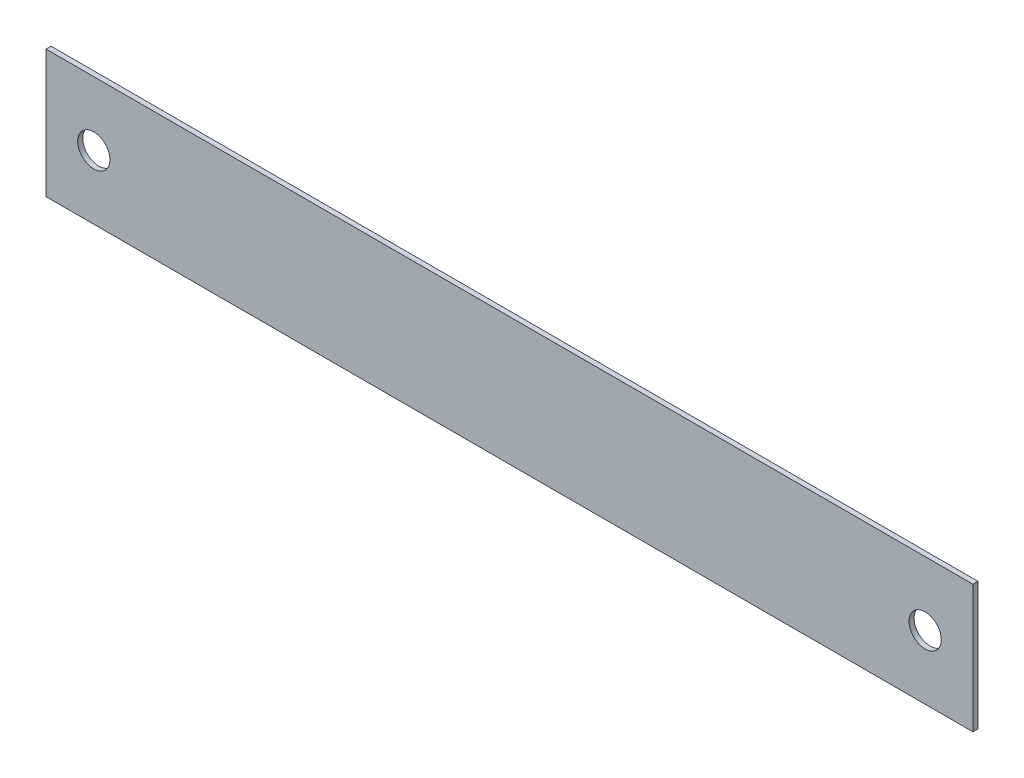
ISO-10303-21;
HEADER;
FILE_DESCRIPTION(('STEP AP214'),'2;1');
FILE_NAME('part.step','',(''),(''),'','','');
FILE_SCHEMA(('AUTOMOTIVE_DESIGN { 1 0 10303 214 1 1 1 1 }'));
ENDSEC;
DATA;
#1=APPLICATION_CONTEXT('core data for automotive mechanical design processes');
#2=APPLICATION_PROTOCOL_DEFINITION('international standard','automotive_design',2000,#1);
#3=PRODUCT_CONTEXT('',#1,'mechanical');
#4=PRODUCT('Part','Part','',(#3));
#5=PRODUCT_RELATED_PRODUCT_CATEGORY('part','',(#4));
#6=PRODUCT_DEFINITION_FORMATION('','',#4);
#7=PRODUCT_DEFINITION_CONTEXT('part definition',#1,'design');
#8=PRODUCT_DEFINITION('design','',#6,#7);
#9=PRODUCT_DEFINITION_SHAPE('','',#8);
#10=(LENGTH_UNIT() NAMED_UNIT(*) SI_UNIT(.MILLI.,.METRE.));
#11=(NAMED_UNIT(*) PLANE_ANGLE_UNIT() SI_UNIT($,.RADIAN.));
#12=(NAMED_UNIT(*) SI_UNIT($,.STERADIAN.) SOLID_ANGLE_UNIT());
#13=UNCERTAINTY_MEASURE_WITH_UNIT(LENGTH_MEASURE(1.E-05),#10,'distance_accuracy_value','');
#14=(GEOMETRIC_REPRESENTATION_CONTEXT(3) GLOBAL_UNCERTAINTY_ASSIGNED_CONTEXT((#13)) GLOBAL_UNIT_ASSIGNED_CONTEXT((#10,
#11,#12)) REPRESENTATION_CONTEXT('',''));
#15=CARTESIAN_POINT('',(0.,0.,0.));
#16=DIRECTION('',(0.,0.,1.));
#17=DIRECTION('',(1.,0.,0.));
#18=AXIS2_PLACEMENT_3D('',#15,#16,#17);
#19=CARTESIAN_POINT('',(0.,0.,0.5));
#20=DIRECTION('',(0.,0.,1.));
#21=DIRECTION('',(1.,0.,0.));
#22=AXIS2_PLACEMENT_3D('',#19,#20,#21);
#23=PLANE('',#22);
#24=CARTESIAN_POINT('',(0.,0.,0.5));
#25=DIRECTION('',(0.,0.,1.));
#26=DIRECTION('',(1.,0.,0.));
#27=AXIS2_PLACEMENT_3D('',#24,#25,#26);
#28=CIRCLE('',#27,1.6);
#29=CARTESIAN_POINT('',(1.6,0.,0.5));
#30=VERTEX_POINT('',#29);
#31=EDGE_CURVE('E106',#30,#30,#28,.T.);
#32=ORIENTED_EDGE('',*,*,#31,.F.);
#33=EDGE_LOOP('',(#32));
#34=FACE_BOUND('',#33,.T.);
#35=DIRECTION('',(0.,-1.,0.));
#36=VECTOR('',#35,1.);
#37=CARTESIAN_POINT('',(-4.75,6.35,0.5));
#38=LINE('',#37,#36);
#39=CARTESIAN_POINT('',(-4.75,6.35,0.5));
#40=VERTEX_POINT('',#39);
#41=CARTESIAN_POINT('',(-4.75,-6.35,0.5));
#42=VERTEX_POINT('',#41);
#43=EDGE_CURVE('E93',#40,#42,#38,.T.);
#44=ORIENTED_EDGE('',*,*,#43,.T.);
#45=DIRECTION('',(1.,0.,0.));
#46=VECTOR('',#45,1.);
#47=CARTESIAN_POINT('',(-4.75,-6.35,0.5));
#48=LINE('',#47,#46);
#49=CARTESIAN_POINT('',(87.35,-6.35,0.5));
#50=VERTEX_POINT('',#49);
#51=EDGE_CURVE('E88',#42,#50,#48,.T.);
#52=ORIENTED_EDGE('',*,*,#51,.T.);
#53=DIRECTION('',(0.,1.,0.));
#54=VECTOR('',#53,1.);
#55=CARTESIAN_POINT('',(87.35,-6.35,0.5));
#56=LINE('',#55,#54);
#57=CARTESIAN_POINT('',(87.35,6.35,0.5));
#58=VERTEX_POINT('',#57);
#59=EDGE_CURVE('E90',#50,#58,#56,.T.);
#60=ORIENTED_EDGE('',*,*,#59,.T.);
#61=DIRECTION('',(-1.,0.,0.));
#62=VECTOR('',#61,1.);
#63=CARTESIAN_POINT('',(87.35,6.35,0.5));
#64=LINE('',#63,#62);
#65=EDGE_CURVE('E57',#58,#40,#64,.T.);
#66=ORIENTED_EDGE('',*,*,#65,.T.);
#67=EDGE_LOOP('',(#44,#52,#60,#66));
#68=FACE_BOUND('',#67,.T.);
#69=CARTESIAN_POINT('',(82.6,0.,0.5));
#70=DIRECTION('',(0.,0.,1.));
#71=DIRECTION('',(1.,0.,0.));
#72=AXIS2_PLACEMENT_3D('',#69,#70,#71);
#73=CIRCLE('',#72,1.6);
#74=CARTESIAN_POINT('',(84.2,0.,0.5));
#75=VERTEX_POINT('',#74);
#76=EDGE_CURVE('E121',#75,#75,#73,.T.);
#77=ORIENTED_EDGE('',*,*,#76,.F.);
#78=EDGE_LOOP('',(#77));
#79=FACE_BOUND('',#78,.T.);
#80=ADVANCED_FACE('F39',(#34,#68,#79),#23,.T.);
#81=CARTESIAN_POINT('',(0.,0.,0.));
#82=DIRECTION('',(0.,0.,1.));
#83=DIRECTION('',(1.,0.,0.));
#84=AXIS2_PLACEMENT_3D('',#81,#82,#83);
#85=PLANE('',#84);
#86=DIRECTION('',(0.,-1.,0.));
#87=VECTOR('',#86,1.);
#88=CARTESIAN_POINT('',(-4.75,6.35,0.));
#89=LINE('',#88,#87);
#90=CARTESIAN_POINT('',(-4.75,6.35,0.));
#91=VERTEX_POINT('',#90);
#92=CARTESIAN_POINT('',(-4.75,-6.35,0.));
#93=VERTEX_POINT('',#92);
#94=EDGE_CURVE('E103',#91,#93,#89,.T.);
#95=ORIENTED_EDGE('',*,*,#94,.F.);
#96=DIRECTION('',(-1.,0.,0.));
#97=VECTOR('',#96,1.);
#98=CARTESIAN_POINT('',(87.35,6.35,0.));
#99=LINE('',#98,#97);
#100=CARTESIAN_POINT('',(87.35,6.35,0.));
#101=VERTEX_POINT('',#100);
#102=EDGE_CURVE('E76',#101,#91,#99,.T.);
#103=ORIENTED_EDGE('',*,*,#102,.F.);
#104=DIRECTION('',(0.,1.,0.));
#105=VECTOR('',#104,1.);
#106=CARTESIAN_POINT('',(87.35,-6.35,0.));
#107=LINE('',#106,#105);
#108=CARTESIAN_POINT('',(87.35,-6.35,0.));
#109=VERTEX_POINT('',#108);
#110=EDGE_CURVE('E71',#109,#101,#107,.T.);
#111=ORIENTED_EDGE('',*,*,#110,.F.);
#112=DIRECTION('',(1.,0.,0.));
#113=VECTOR('',#112,1.);
#114=CARTESIAN_POINT('',(-4.75,-6.35,0.));
#115=LINE('',#114,#113);
#116=EDGE_CURVE('E92',#93,#109,#115,.T.);
#117=ORIENTED_EDGE('',*,*,#116,.F.);
#118=EDGE_LOOP('',(#95,#103,#111,#117));
#119=FACE_BOUND('',#118,.T.);
#120=CARTESIAN_POINT('',(0.,0.,0.));
#121=DIRECTION('',(0.,0.,1.));
#122=DIRECTION('',(1.,0.,0.));
#123=AXIS2_PLACEMENT_3D('',#120,#121,#122);
#124=CIRCLE('',#123,1.6);
#125=CARTESIAN_POINT('',(1.6,0.,0.));
#126=VERTEX_POINT('',#125);
#127=EDGE_CURVE('E119',#126,#126,#124,.T.);
#128=ORIENTED_EDGE('',*,*,#127,.T.);
#129=EDGE_LOOP('',(#128));
#130=FACE_BOUND('',#129,.T.);
#131=CARTESIAN_POINT('',(82.6,0.,0.));
#132=DIRECTION('',(0.,0.,1.));
#133=DIRECTION('',(1.,0.,0.));
#134=AXIS2_PLACEMENT_3D('',#131,#132,#133);
#135=CIRCLE('',#134,1.6);
#136=CARTESIAN_POINT('',(84.2,0.,0.));
#137=VERTEX_POINT('',#136);
#138=EDGE_CURVE('E123',#137,#137,#135,.T.);
#139=ORIENTED_EDGE('',*,*,#138,.T.);
#140=EDGE_LOOP('',(#139));
#141=FACE_BOUND('',#140,.T.);
#142=ADVANCED_FACE('F111',(#119,#130,#141),#85,.F.);
#143=CARTESIAN_POINT('',(-4.75,6.35,0.5));
#144=DIRECTION('',(1.,0.,0.));
#145=DIRECTION('',(0.,0.,-1.));
#146=AXIS2_PLACEMENT_3D('',#143,#144,#145);
#147=PLANE('',#146);
#148=ORIENTED_EDGE('',*,*,#94,.T.);
#149=DIRECTION('',(0.,0.,-1.));
#150=VECTOR('',#149,1.);
#151=CARTESIAN_POINT('',(-4.75,-6.35,0.5));
#152=LINE('',#151,#150);
#153=EDGE_CURVE('E11',#42,#93,#152,.T.);
#154=ORIENTED_EDGE('',*,*,#153,.F.);
#155=ORIENTED_EDGE('',*,*,#43,.F.);
#156=DIRECTION('',(0.,0.,-1.));
#157=VECTOR('',#156,1.);
#158=CARTESIAN_POINT('',(-4.75,6.35,0.5));
#159=LINE('',#158,#157);
#160=EDGE_CURVE('E97',#40,#91,#159,.T.);
#161=ORIENTED_EDGE('',*,*,#160,.T.);
#162=EDGE_LOOP('',(#148,#154,#155,#161));
#163=FACE_BOUND('',#162,.T.);
#164=ADVANCED_FACE('F41',(#163),#147,.F.);
#165=CARTESIAN_POINT('',(-4.75,-6.35,0.5));
#166=DIRECTION('',(0.,1.,0.));
#167=DIRECTION('',(0.,0.,1.));
#168=AXIS2_PLACEMENT_3D('',#165,#166,#167);
#169=PLANE('',#168);
#170=ORIENTED_EDGE('',*,*,#116,.T.);
#171=DIRECTION('',(0.,0.,-1.));
#172=VECTOR('',#171,1.);
#173=CARTESIAN_POINT('',(87.35,-6.35,0.5));
#174=LINE('',#173,#172);
#175=EDGE_CURVE('E48',#50,#109,#174,.T.);
#176=ORIENTED_EDGE('',*,*,#175,.F.);
#177=ORIENTED_EDGE('',*,*,#51,.F.);
#178=ORIENTED_EDGE('',*,*,#153,.T.);
#179=EDGE_LOOP('',(#170,#176,#177,#178));
#180=FACE_BOUND('',#179,.T.);
#181=ADVANCED_FACE('F94',(#180),#169,.F.);
#182=CARTESIAN_POINT('',(87.35,-6.35,0.5));
#183=DIRECTION('',(-1.,0.,0.));
#184=DIRECTION('',(0.,0.,1.));
#185=AXIS2_PLACEMENT_3D('',#182,#183,#184);
#186=PLANE('',#185);
#187=ORIENTED_EDGE('',*,*,#110,.T.);
#188=DIRECTION('',(0.,0.,-1.));
#189=VECTOR('',#188,1.);
#190=CARTESIAN_POINT('',(87.35,6.35,0.5));
#191=LINE('',#190,#189);
#192=EDGE_CURVE('E96',#58,#101,#191,.T.);
#193=ORIENTED_EDGE('',*,*,#192,.F.);
#194=ORIENTED_EDGE('',*,*,#59,.F.);
#195=ORIENTED_EDGE('',*,*,#175,.T.);
#196=EDGE_LOOP('',(#187,#193,#194,#195));
#197=FACE_BOUND('',#196,.T.);
#198=ADVANCED_FACE('F100',(#197),#186,.F.);
#199=CARTESIAN_POINT('',(87.35,6.35,0.5));
#200=DIRECTION('',(0.,-1.,0.));
#201=DIRECTION('',(0.,0.,-1.));
#202=AXIS2_PLACEMENT_3D('',#199,#200,#201);
#203=PLANE('',#202);
#204=ORIENTED_EDGE('',*,*,#102,.T.);
#205=ORIENTED_EDGE('',*,*,#160,.F.);
#206=ORIENTED_EDGE('',*,*,#65,.F.);
#207=ORIENTED_EDGE('',*,*,#192,.T.);
#208=EDGE_LOOP('',(#204,#205,#206,#207));
#209=FACE_BOUND('',#208,.T.);
#210=ADVANCED_FACE('F112',(#209),#203,.F.);
#211=CARTESIAN_POINT('',(0.,0.,0.5));
#212=DIRECTION('',(0.,0.,-1.));
#213=DIRECTION('',(-1.,0.,0.));
#214=AXIS2_PLACEMENT_3D('',#211,#212,#213);
#215=CYLINDRICAL_SURFACE('',#214,1.6);
#216=ORIENTED_EDGE('',*,*,#31,.T.);
#217=EDGE_LOOP('',(#216));
#218=FACE_BOUND('',#217,.T.);
#219=ORIENTED_EDGE('',*,*,#127,.F.);
#220=EDGE_LOOP('',(#219));
#221=FACE_BOUND('',#220,.T.);
#222=ADVANCED_FACE('F143',(#218,#221),#215,.F.);
#223=CARTESIAN_POINT('',(82.6,0.,0.5));
#224=DIRECTION('',(0.,0.,-1.));
#225=DIRECTION('',(-1.,0.,0.));
#226=AXIS2_PLACEMENT_3D('',#223,#224,#225);
#227=CYLINDRICAL_SURFACE('',#226,1.6);
#228=ORIENTED_EDGE('',*,*,#76,.T.);
#229=EDGE_LOOP('',(#228));
#230=FACE_BOUND('',#229,.T.);
#231=ORIENTED_EDGE('',*,*,#138,.F.);
#232=EDGE_LOOP('',(#231));
#233=FACE_BOUND('',#232,.T.);
#234=ADVANCED_FACE('F128',(#230,#233),#227,.F.);
#235=CLOSED_SHELL('',(#80,#142,#164,#181,#198,#210,#222,#234));
#236=MANIFOLD_SOLID_BREP('B2',#235);
#237=ADVANCED_BREP_SHAPE_REPRESENTATION('',(#18,#236),#14);
#238=SHAPE_DEFINITION_REPRESENTATION(#9,#237);
ENDSEC;
END-ISO-10303-21;
